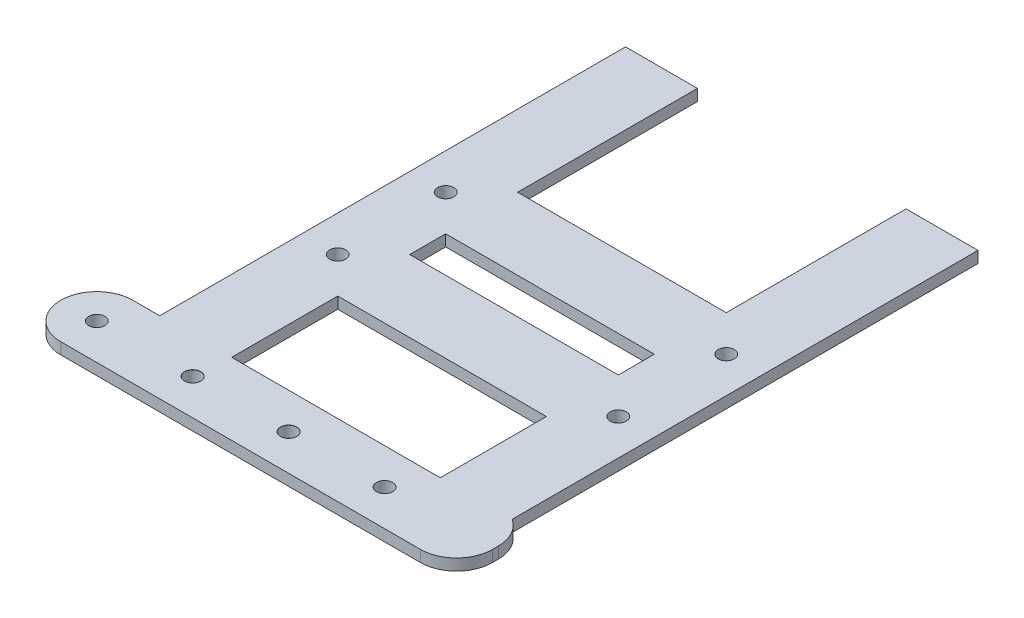
ISO-10303-21;
HEADER;
FILE_DESCRIPTION(('STEP AP214'),'2;1');
FILE_NAME('part.step','',(''),(''),'','','');
FILE_SCHEMA(('AUTOMOTIVE_DESIGN { 1 0 10303 214 1 1 1 1 }'));
ENDSEC;
DATA;
#1=APPLICATION_CONTEXT('core data for automotive mechanical design processes');
#2=APPLICATION_PROTOCOL_DEFINITION('international standard','automotive_design',2000,#1);
#3=PRODUCT_CONTEXT('',#1,'mechanical');
#4=PRODUCT('Part','Part','',(#3));
#5=PRODUCT_RELATED_PRODUCT_CATEGORY('part','',(#4));
#6=PRODUCT_DEFINITION_FORMATION('','',#4);
#7=PRODUCT_DEFINITION_CONTEXT('part definition',#1,'design');
#8=PRODUCT_DEFINITION('design','',#6,#7);
#9=PRODUCT_DEFINITION_SHAPE('','',#8);
#10=(LENGTH_UNIT() NAMED_UNIT(*) SI_UNIT(.MILLI.,.METRE.));
#11=(NAMED_UNIT(*) PLANE_ANGLE_UNIT() SI_UNIT($,.RADIAN.));
#12=(NAMED_UNIT(*) SI_UNIT($,.STERADIAN.) SOLID_ANGLE_UNIT());
#13=UNCERTAINTY_MEASURE_WITH_UNIT(LENGTH_MEASURE(1.E-05),#10,'distance_accuracy_value','');
#14=(GEOMETRIC_REPRESENTATION_CONTEXT(3) GLOBAL_UNCERTAINTY_ASSIGNED_CONTEXT((#13)) GLOBAL_UNIT_ASSIGNED_CONTEXT((#10,
#11,#12)) REPRESENTATION_CONTEXT('',''));
#15=CARTESIAN_POINT('',(0.,0.,0.));
#16=DIRECTION('',(0.,0.,1.));
#17=DIRECTION('',(1.,0.,0.));
#18=AXIS2_PLACEMENT_3D('',#15,#16,#17);
#19=CARTESIAN_POINT('',(0.,3.175,0.));
#20=DIRECTION('',(0.,-1.,0.));
#21=DIRECTION('',(0.,0.,-1.));
#22=AXIS2_PLACEMENT_3D('',#19,#20,#21);
#23=PLANE('',#22);
#24=CARTESIAN_POINT('',(13.3333333333333,3.175,190.));
#25=DIRECTION('',(0.,-1.,0.));
#26=DIRECTION('',(0.,0.,-1.));
#27=AXIS2_PLACEMENT_3D('',#24,#25,#26);
#28=CIRCLE('',#27,2.275);
#29=CARTESIAN_POINT('',(13.3333333333333,3.175,187.725));
#30=VERTEX_POINT('',#29);
#31=EDGE_CURVE('E819',#30,#30,#28,.T.);
#32=ORIENTED_EDGE('',*,*,#31,.T.);
#33=EDGE_LOOP('',(#32));
#34=FACE_BOUND('',#33,.T.);
#35=CARTESIAN_POINT('',(-13.3333333333333,3.175,190.));
#36=DIRECTION('',(0.,-1.,0.));
#37=DIRECTION('',(0.,0.,-1.));
#38=AXIS2_PLACEMENT_3D('',#35,#36,#37);
#39=CIRCLE('',#38,2.275);
#40=CARTESIAN_POINT('',(-13.3333333333333,3.175,187.725));
#41=VERTEX_POINT('',#40);
#42=EDGE_CURVE('E827',#41,#41,#39,.T.);
#43=ORIENTED_EDGE('',*,*,#42,.T.);
#44=EDGE_LOOP('',(#43));
#45=FACE_BOUND('',#44,.T.);
#46=DIRECTION('',(-1.,0.,0.));
#47=VECTOR('',#46,1.);
#48=CARTESIAN_POINT('',(-12.5,3.175,150.5));
#49=LINE('',#48,#47);
#50=CARTESIAN_POINT('',(45.5,3.175,150.5));
#51=VERTEX_POINT('',#50);
#52=CARTESIAN_POINT('',(-12.5,3.175,150.5));
#53=VERTEX_POINT('',#52);
#54=EDGE_CURVE('E382',#51,#53,#49,.T.);
#55=ORIENTED_EDGE('',*,*,#54,.F.);
#56=DIRECTION('',(0.,0.,-1.));
#57=VECTOR('',#56,1.);
#58=CARTESIAN_POINT('',(45.5,3.175,150.5));
#59=LINE('',#58,#57);
#60=CARTESIAN_POINT('',(45.5,3.175,180.));
#61=VERTEX_POINT('',#60);
#62=EDGE_CURVE('E379',#61,#51,#59,.T.);
#63=ORIENTED_EDGE('',*,*,#62,.F.);
#64=DIRECTION('',(1.,0.,0.));
#65=VECTOR('',#64,1.);
#66=CARTESIAN_POINT('',(-12.5,3.175,180.));
#67=LINE('',#66,#65);
#68=CARTESIAN_POINT('',(-12.5,3.175,180.));
#69=VERTEX_POINT('',#68);
#70=EDGE_CURVE('E375',#69,#61,#67,.T.);
#71=ORIENTED_EDGE('',*,*,#70,.F.);
#72=DIRECTION('',(0.,0.,1.));
#73=VECTOR('',#72,1.);
#74=CARTESIAN_POINT('',(-12.5,3.175,150.5));
#75=LINE('',#74,#73);
#76=EDGE_CURVE('E374',#53,#69,#75,.T.);
#77=ORIENTED_EDGE('',*,*,#76,.F.);
#78=EDGE_LOOP('',(#55,#63,#71,#77));
#79=FACE_BOUND('',#78,.T.);
#80=DIRECTION('',(0.,0.,1.));
#81=VECTOR('',#80,1.);
#82=CARTESIAN_POINT('',(65.5,3.175,-85.));
#83=LINE('',#82,#81);
#84=CARTESIAN_POINT('',(65.5,3.175,50.5));
#85=VERTEX_POINT('',#84);
#86=CARTESIAN_POINT('',(65.5,3.175,180.));
#87=VERTEX_POINT('',#86);
#88=EDGE_CURVE('E225',#85,#87,#83,.T.);
#89=ORIENTED_EDGE('',*,*,#88,.F.);
#90=DIRECTION('',(1.,0.,0.));
#91=VECTOR('',#90,1.);
#92=CARTESIAN_POINT('',(-50.,3.175,50.5));
#93=LINE('',#92,#91);
#94=CARTESIAN_POINT('',(45.5,3.175,50.5));
#95=VERTEX_POINT('',#94);
#96=EDGE_CURVE('E215',#95,#85,#93,.T.);
#97=ORIENTED_EDGE('',*,*,#96,.F.);
#98=DIRECTION('',(0.,0.,-1.));
#99=VECTOR('',#98,1.);
#100=CARTESIAN_POINT('',(45.5,3.175,34.5));
#101=LINE('',#100,#99);
#102=CARTESIAN_POINT('',(45.5,3.175,100.5));
#103=VERTEX_POINT('',#102);
#104=EDGE_CURVE('E398',#103,#95,#101,.T.);
#105=ORIENTED_EDGE('',*,*,#104,.F.);
#106=DIRECTION('',(1.,0.,0.));
#107=VECTOR('',#106,1.);
#108=CARTESIAN_POINT('',(-12.5,3.175,100.5));
#109=LINE('',#108,#107);
#110=CARTESIAN_POINT('',(-12.5,3.175,100.5));
#111=VERTEX_POINT('',#110);
#112=EDGE_CURVE('E400',#111,#103,#109,.T.);
#113=ORIENTED_EDGE('',*,*,#112,.F.);
#114=DIRECTION('',(0.,0.,1.));
#115=VECTOR('',#114,1.);
#116=CARTESIAN_POINT('',(-12.5,3.175,34.5));
#117=LINE('',#116,#115);
#118=CARTESIAN_POINT('',(-12.5,3.175,50.5));
#119=VERTEX_POINT('',#118);
#120=EDGE_CURVE('E214',#119,#111,#117,.T.);
#121=ORIENTED_EDGE('',*,*,#120,.F.);
#122=CARTESIAN_POINT('',(-32.5,3.175,50.5));
#123=VERTEX_POINT('',#122);
#124=EDGE_CURVE('E72',#123,#119,#93,.T.);
#125=ORIENTED_EDGE('',*,*,#124,.F.);
#126=DIRECTION('',(0.,0.,-1.));
#127=VECTOR('',#126,1.);
#128=CARTESIAN_POINT('',(-32.5,3.175,180.));
#129=LINE('',#128,#127);
#130=CARTESIAN_POINT('',(-32.5,3.175,180.));
#131=VERTEX_POINT('',#130);
#132=EDGE_CURVE('E212',#131,#123,#129,.T.);
#133=ORIENTED_EDGE('',*,*,#132,.F.);
#134=DIRECTION('',(1.,0.,0.));
#135=VECTOR('',#134,1.);
#136=CARTESIAN_POINT('',(-32.5,3.175,180.));
#137=LINE('',#136,#135);
#138=CARTESIAN_POINT('',(-40.,3.175,180.));
#139=VERTEX_POINT('',#138);
#140=EDGE_CURVE('E222',#139,#131,#137,.T.);
#141=ORIENTED_EDGE('',*,*,#140,.F.);
#142=CARTESIAN_POINT('',(-40.,3.17499999999998,190.));
#143=DIRECTION('',(0.,-1.,0.));
#144=DIRECTION('',(0.,0.,-1.));
#145=AXIS2_PLACEMENT_3D('',#142,#143,#144);
#146=CIRCLE('',#145,10.);
#147=CARTESIAN_POINT('',(-50.,3.175,190.));
#148=VERTEX_POINT('',#147);
#149=EDGE_CURVE('E283',#139,#148,#146,.F.);
#150=ORIENTED_EDGE('',*,*,#149,.T.);
#151=CARTESIAN_POINT('',(-40.,3.175,190.));
#152=DIRECTION('',(0.,-1.,0.));
#153=DIRECTION('',(0.,0.,-1.));
#154=AXIS2_PLACEMENT_3D('',#151,#152,#153);
#155=CIRCLE('',#154,10.);
#156=CARTESIAN_POINT('',(-40.,3.175,200.));
#157=VERTEX_POINT('',#156);
#158=EDGE_CURVE('E279',#148,#157,#155,.F.);
#159=ORIENTED_EDGE('',*,*,#158,.T.);
#160=DIRECTION('',(1.,0.,0.));
#161=VECTOR('',#160,1.);
#162=CARTESIAN_POINT('',(-50.,3.175,200.));
#163=LINE('',#162,#161);
#164=CARTESIAN_POINT('',(60.,3.175,200.));
#165=VERTEX_POINT('',#164);
#166=EDGE_CURVE('E276',#157,#165,#163,.T.);
#167=ORIENTED_EDGE('',*,*,#166,.T.);
#168=CARTESIAN_POINT('',(60.,3.175,190.));
#169=DIRECTION('',(0.,-1.,0.));
#170=DIRECTION('',(0.,0.,-1.));
#171=AXIS2_PLACEMENT_3D('',#168,#169,#170);
#172=CIRCLE('',#171,10.);
#173=CARTESIAN_POINT('',(70.,3.175,190.));
#174=VERTEX_POINT('',#173);
#175=EDGE_CURVE('E285',#165,#174,#172,.F.);
#176=ORIENTED_EDGE('',*,*,#175,.T.);
#177=DIRECTION('',(0.,0.,1.));
#178=VECTOR('',#177,1.);
#179=CARTESIAN_POINT('',(70.,3.175,200.));
#180=LINE('',#179,#178);
#181=CARTESIAN_POINT('',(70.,3.17499999999998,188.351646544245));
#182=VERTEX_POINT('',#181);
#183=EDGE_CURVE('E260',#182,#174,#180,.T.);
#184=ORIENTED_EDGE('',*,*,#183,.F.);
#185=CARTESIAN_POINT('',(60.,3.17499999999998,188.351646544245));
#186=DIRECTION('',(0.,-1.,0.));
#187=DIRECTION('',(0.,0.,-1.));
#188=AXIS2_PLACEMENT_3D('',#185,#186,#187);
#189=CIRCLE('',#188,10.);
#190=EDGE_CURVE('E287',#182,#87,#189,.F.);
#191=ORIENTED_EDGE('',*,*,#190,.T.);
#192=EDGE_LOOP('',(#89,#97,#105,#113,#121,#125,#133,#141,#150,#159,#167,#176,#184,#191));
#193=FACE_BOUND('',#192,.T.);
#194=DIRECTION('',(0.,0.,-1.));
#195=VECTOR('',#194,1.);
#196=CARTESIAN_POINT('',(45.5,3.175,120.5));
#197=LINE('',#196,#195);
#198=CARTESIAN_POINT('',(45.5,3.175,130.5));
#199=VERTEX_POINT('',#198);
#200=CARTESIAN_POINT('',(45.5,3.175,120.5));
#201=VERTEX_POINT('',#200);
#202=EDGE_CURVE('E349',#199,#201,#197,.T.);
#203=ORIENTED_EDGE('',*,*,#202,.F.);
#204=DIRECTION('',(1.,0.,0.));
#205=VECTOR('',#204,1.);
#206=CARTESIAN_POINT('',(-12.5,3.175,130.5));
#207=LINE('',#206,#205);
#208=CARTESIAN_POINT('',(-12.5,3.175,130.5));
#209=VERTEX_POINT('',#208);
#210=EDGE_CURVE('E346',#209,#199,#207,.T.);
#211=ORIENTED_EDGE('',*,*,#210,.F.);
#212=DIRECTION('',(0.,0.,1.));
#213=VECTOR('',#212,1.);
#214=CARTESIAN_POINT('',(-12.5,3.175,130.5));
#215=LINE('',#214,#213);
#216=CARTESIAN_POINT('',(-12.5,3.175,120.5));
#217=VERTEX_POINT('',#216);
#218=EDGE_CURVE('E342',#217,#209,#215,.T.);
#219=ORIENTED_EDGE('',*,*,#218,.F.);
#220=DIRECTION('',(-1.,0.,0.));
#221=VECTOR('',#220,1.);
#222=CARTESIAN_POINT('',(-12.5,3.175,120.5));
#223=LINE('',#222,#221);
#224=EDGE_CURVE('E341',#201,#217,#223,.T.);
#225=ORIENTED_EDGE('',*,*,#224,.F.);
#226=EDGE_LOOP('',(#203,#211,#219,#225));
#227=FACE_BOUND('',#226,.T.);
#228=CARTESIAN_POINT('',(40.,3.175,190.));
#229=DIRECTION('',(0.,1.,0.));
#230=DIRECTION('',(0.,0.,1.));
#231=AXIS2_PLACEMENT_3D('',#228,#229,#230);
#232=CIRCLE('',#231,2.25);
#233=CARTESIAN_POINT('',(40.,3.175,192.25));
#234=VERTEX_POINT('',#233);
#235=EDGE_CURVE('E263',#234,#234,#232,.T.);
#236=ORIENTED_EDGE('',*,*,#235,.F.);
#237=EDGE_LOOP('',(#236));
#238=FACE_BOUND('',#237,.T.);
#239=CARTESIAN_POINT('',(-40.,3.175,190.));
#240=DIRECTION('',(0.,1.,0.));
#241=DIRECTION('',(0.,0.,1.));
#242=AXIS2_PLACEMENT_3D('',#239,#240,#241);
#243=CIRCLE('',#242,2.25);
#244=CARTESIAN_POINT('',(-40.,3.175,192.25));
#245=VERTEX_POINT('',#244);
#246=EDGE_CURVE('E269',#245,#245,#243,.T.);
#247=ORIENTED_EDGE('',*,*,#246,.F.);
#248=EDGE_LOOP('',(#247));
#249=FACE_BOUND('',#248,.T.);
#250=CARTESIAN_POINT('',(-22.5,3.175,140.5));
#251=DIRECTION('',(0.,1.,0.));
#252=DIRECTION('',(0.,0.,1.));
#253=AXIS2_PLACEMENT_3D('',#250,#251,#252);
#254=CIRCLE('',#253,2.25);
#255=CARTESIAN_POINT('',(-22.5,3.175,142.75));
#256=VERTEX_POINT('',#255);
#257=EDGE_CURVE('E251',#256,#256,#254,.T.);
#258=ORIENTED_EDGE('',*,*,#257,.F.);
#259=EDGE_LOOP('',(#258));
#260=FACE_BOUND('',#259,.T.);
#261=CARTESIAN_POINT('',(-22.5,3.175,110.5));
#262=DIRECTION('',(0.,1.,0.));
#263=DIRECTION('',(0.,0.,1.));
#264=AXIS2_PLACEMENT_3D('',#261,#262,#263);
#265=CIRCLE('',#264,2.25);
#266=CARTESIAN_POINT('',(-22.5,3.175,112.75));
#267=VERTEX_POINT('',#266);
#268=EDGE_CURVE('E245',#267,#267,#265,.T.);
#269=ORIENTED_EDGE('',*,*,#268,.F.);
#270=EDGE_LOOP('',(#269));
#271=FACE_BOUND('',#270,.T.);
#272=CARTESIAN_POINT('',(55.5,3.175,110.5));
#273=DIRECTION('',(0.,1.,0.));
#274=DIRECTION('',(0.,0.,1.));
#275=AXIS2_PLACEMENT_3D('',#272,#273,#274);
#276=CIRCLE('',#275,2.25);
#277=CARTESIAN_POINT('',(55.5,3.175,112.75));
#278=VERTEX_POINT('',#277);
#279=EDGE_CURVE('E239',#278,#278,#276,.T.);
#280=ORIENTED_EDGE('',*,*,#279,.F.);
#281=EDGE_LOOP('',(#280));
#282=FACE_BOUND('',#281,.T.);
#283=CARTESIAN_POINT('',(55.5,3.175,140.5));
#284=DIRECTION('',(0.,1.,0.));
#285=DIRECTION('',(0.,0.,1.));
#286=AXIS2_PLACEMENT_3D('',#283,#284,#285);
#287=CIRCLE('',#286,2.25);
#288=CARTESIAN_POINT('',(55.5,3.175,142.75));
#289=VERTEX_POINT('',#288);
#290=EDGE_CURVE('E232',#289,#289,#287,.T.);
#291=ORIENTED_EDGE('',*,*,#290,.F.);
#292=EDGE_LOOP('',(#291));
#293=FACE_BOUND('',#292,.T.);
#294=ADVANCED_FACE('F49',(#34,#45,#79,#193,#227,#238,#249,#260,#271,#282,#293),#23,.F.);
#295=CARTESIAN_POINT('',(-50.,3.175,200.));
#296=DIRECTION('',(0.,0.,-1.));
#297=DIRECTION('',(-1.,0.,0.));
#298=AXIS2_PLACEMENT_3D('',#295,#296,#297);
#299=PLANE('',#298);
#300=DIRECTION('',(1.,0.,0.));
#301=VECTOR('',#300,1.);
#302=CARTESIAN_POINT('',(-50.,0.,200.));
#303=LINE('',#302,#301);
#304=CARTESIAN_POINT('',(-40.,0.,200.));
#305=VERTEX_POINT('',#304);
#306=CARTESIAN_POINT('',(60.,0.,200.));
#307=VERTEX_POINT('',#306);
#308=EDGE_CURVE('E275',#305,#307,#303,.T.);
#309=ORIENTED_EDGE('',*,*,#308,.T.);
#310=DIRECTION('',(0.,-1.,0.));
#311=VECTOR('',#310,1.);
#312=CARTESIAN_POINT('',(60.,3.175,200.));
#313=LINE('',#312,#311);
#314=EDGE_CURVE('E57',#307,#165,#313,.F.);
#315=ORIENTED_EDGE('',*,*,#314,.T.);
#316=ORIENTED_EDGE('',*,*,#166,.F.);
#317=DIRECTION('',(0.,-1.,0.));
#318=VECTOR('',#317,1.);
#319=CARTESIAN_POINT('',(-40.,3.175,200.));
#320=LINE('',#319,#318);
#321=EDGE_CURVE('E307',#157,#305,#320,.T.);
#322=ORIENTED_EDGE('',*,*,#321,.T.);
#323=EDGE_LOOP('',(#309,#315,#316,#322));
#324=FACE_BOUND('',#323,.T.);
#325=ADVANCED_FACE('F428',(#324),#299,.F.);
#326=CARTESIAN_POINT('',(0.,0.,0.));
#327=DIRECTION('',(0.,-1.,0.));
#328=DIRECTION('',(0.,0.,-1.));
#329=AXIS2_PLACEMENT_3D('',#326,#327,#328);
#330=PLANE('',#329);
#331=CARTESIAN_POINT('',(13.3333333333333,0.,190.));
#332=DIRECTION('',(0.,-1.,0.));
#333=DIRECTION('',(0.,0.,-1.));
#334=AXIS2_PLACEMENT_3D('',#331,#332,#333);
#335=CIRCLE('',#334,2.275);
#336=CARTESIAN_POINT('',(13.3333333333333,0.,187.725));
#337=VERTEX_POINT('',#336);
#338=EDGE_CURVE('E818',#337,#337,#335,.T.);
#339=ORIENTED_EDGE('',*,*,#338,.F.);
#340=EDGE_LOOP('',(#339));
#341=FACE_BOUND('',#340,.T.);
#342=CARTESIAN_POINT('',(-13.3333333333333,0.,190.));
#343=DIRECTION('',(0.,-1.,0.));
#344=DIRECTION('',(0.,0.,-1.));
#345=AXIS2_PLACEMENT_3D('',#342,#343,#344);
#346=CIRCLE('',#345,2.275);
#347=CARTESIAN_POINT('',(-13.3333333333333,0.,187.725));
#348=VERTEX_POINT('',#347);
#349=EDGE_CURVE('E830',#348,#348,#346,.T.);
#350=ORIENTED_EDGE('',*,*,#349,.F.);
#351=EDGE_LOOP('',(#350));
#352=FACE_BOUND('',#351,.T.);
#353=DIRECTION('',(1.,0.,0.));
#354=VECTOR('',#353,1.);
#355=CARTESIAN_POINT('',(-50.,0.,50.5));
#356=LINE('',#355,#354);
#357=CARTESIAN_POINT('',(45.5,0.,50.5));
#358=VERTEX_POINT('',#357);
#359=CARTESIAN_POINT('',(65.5,0.,50.5));
#360=VERTEX_POINT('',#359);
#361=EDGE_CURVE('E64',#358,#360,#356,.T.);
#362=ORIENTED_EDGE('',*,*,#361,.T.);
#363=DIRECTION('',(0.,0.,1.));
#364=VECTOR('',#363,1.);
#365=CARTESIAN_POINT('',(65.5,0.,-85.));
#366=LINE('',#365,#364);
#367=CARTESIAN_POINT('',(65.5,0.,180.));
#368=VERTEX_POINT('',#367);
#369=EDGE_CURVE('E406',#360,#368,#366,.T.);
#370=ORIENTED_EDGE('',*,*,#369,.T.);
#371=CARTESIAN_POINT('',(60.,0.,188.351646544245));
#372=DIRECTION('',(0.,-1.,0.));
#373=DIRECTION('',(0.,0.,-1.));
#374=AXIS2_PLACEMENT_3D('',#371,#372,#373);
#375=CIRCLE('',#374,10.);
#376=CARTESIAN_POINT('',(70.,0.,188.351646544245));
#377=VERTEX_POINT('',#376);
#378=EDGE_CURVE('E296',#368,#377,#375,.T.);
#379=ORIENTED_EDGE('',*,*,#378,.T.);
#380=DIRECTION('',(0.,0.,-1.));
#381=VECTOR('',#380,1.);
#382=CARTESIAN_POINT('',(70.,0.,200.));
#383=LINE('',#382,#381);
#384=CARTESIAN_POINT('',(70.,0.,190.));
#385=VERTEX_POINT('',#384);
#386=EDGE_CURVE('E257',#385,#377,#383,.T.);
#387=ORIENTED_EDGE('',*,*,#386,.F.);
#388=CARTESIAN_POINT('',(60.,0.,190.));
#389=DIRECTION('',(0.,-1.,0.));
#390=DIRECTION('',(0.,0.,-1.));
#391=AXIS2_PLACEMENT_3D('',#388,#389,#390);
#392=CIRCLE('',#391,10.);
#393=EDGE_CURVE('E294',#385,#307,#392,.T.);
#394=ORIENTED_EDGE('',*,*,#393,.T.);
#395=ORIENTED_EDGE('',*,*,#308,.F.);
#396=CARTESIAN_POINT('',(-40.,0.,190.));
#397=DIRECTION('',(0.,-1.,0.));
#398=DIRECTION('',(0.,0.,-1.));
#399=AXIS2_PLACEMENT_3D('',#396,#397,#398);
#400=CIRCLE('',#399,10.);
#401=CARTESIAN_POINT('',(-50.,0.,190.));
#402=VERTEX_POINT('',#401);
#403=EDGE_CURVE('E290',#305,#402,#400,.T.);
#404=ORIENTED_EDGE('',*,*,#403,.T.);
#405=CARTESIAN_POINT('',(-40.,0.,190.));
#406=DIRECTION('',(0.,-1.,0.));
#407=DIRECTION('',(0.,0.,-1.));
#408=AXIS2_PLACEMENT_3D('',#405,#406,#407);
#409=CIRCLE('',#408,10.);
#410=CARTESIAN_POINT('',(-40.,0.,180.));
#411=VERTEX_POINT('',#410);
#412=EDGE_CURVE('E292',#402,#411,#409,.T.);
#413=ORIENTED_EDGE('',*,*,#412,.T.);
#414=DIRECTION('',(1.,0.,0.));
#415=VECTOR('',#414,1.);
#416=CARTESIAN_POINT('',(-32.5,0.,180.));
#417=LINE('',#416,#415);
#418=CARTESIAN_POINT('',(-32.5,0.,180.));
#419=VERTEX_POINT('',#418);
#420=EDGE_CURVE('E221',#411,#419,#417,.T.);
#421=ORIENTED_EDGE('',*,*,#420,.T.);
#422=DIRECTION('',(0.,0.,-1.));
#423=VECTOR('',#422,1.);
#424=CARTESIAN_POINT('',(-32.5,0.,180.));
#425=LINE('',#424,#423);
#426=CARTESIAN_POINT('',(-32.5,0.,50.5));
#427=VERTEX_POINT('',#426);
#428=EDGE_CURVE('E230',#419,#427,#425,.T.);
#429=ORIENTED_EDGE('',*,*,#428,.T.);
#430=CARTESIAN_POINT('',(-12.5,0.,50.5));
#431=VERTEX_POINT('',#430);
#432=EDGE_CURVE('E198',#427,#431,#356,.T.);
#433=ORIENTED_EDGE('',*,*,#432,.T.);
#434=DIRECTION('',(0.,0.,1.));
#435=VECTOR('',#434,1.);
#436=CARTESIAN_POINT('',(-12.5,0.,34.5));
#437=LINE('',#436,#435);
#438=CARTESIAN_POINT('',(-12.5,0.,100.5));
#439=VERTEX_POINT('',#438);
#440=EDGE_CURVE('E388',#431,#439,#437,.T.);
#441=ORIENTED_EDGE('',*,*,#440,.T.);
#442=DIRECTION('',(1.,0.,0.));
#443=VECTOR('',#442,1.);
#444=CARTESIAN_POINT('',(-12.5,0.,100.5));
#445=LINE('',#444,#443);
#446=CARTESIAN_POINT('',(45.5,0.,100.5));
#447=VERTEX_POINT('',#446);
#448=EDGE_CURVE('E391',#439,#447,#445,.T.);
#449=ORIENTED_EDGE('',*,*,#448,.T.);
#450=DIRECTION('',(0.,0.,-1.));
#451=VECTOR('',#450,1.);
#452=CARTESIAN_POINT('',(45.5,0.,34.5));
#453=LINE('',#452,#451);
#454=EDGE_CURVE('E392',#447,#358,#453,.T.);
#455=ORIENTED_EDGE('',*,*,#454,.T.);
#456=EDGE_LOOP('',(#362,#370,#379,#387,#394,#395,#404,#413,#421,#429,#433,#441,#449,#455));
#457=FACE_BOUND('',#456,.T.);
#458=DIRECTION('',(0.,0.,-1.));
#459=VECTOR('',#458,1.);
#460=CARTESIAN_POINT('',(45.5,0.,150.5));
#461=LINE('',#460,#459);
#462=CARTESIAN_POINT('',(45.5,0.,180.));
#463=VERTEX_POINT('',#462);
#464=CARTESIAN_POINT('',(45.5,0.,150.5));
#465=VERTEX_POINT('',#464);
#466=EDGE_CURVE('E358',#463,#465,#461,.T.);
#467=ORIENTED_EDGE('',*,*,#466,.T.);
#468=DIRECTION('',(-1.,0.,0.));
#469=VECTOR('',#468,1.);
#470=CARTESIAN_POINT('',(-12.5,0.,150.5));
#471=LINE('',#470,#469);
#472=CARTESIAN_POINT('',(-12.5,0.,150.5));
#473=VERTEX_POINT('',#472);
#474=EDGE_CURVE('E359',#465,#473,#471,.T.);
#475=ORIENTED_EDGE('',*,*,#474,.T.);
#476=DIRECTION('',(0.,0.,1.));
#477=VECTOR('',#476,1.);
#478=CARTESIAN_POINT('',(-12.5,0.,150.5));
#479=LINE('',#478,#477);
#480=CARTESIAN_POINT('',(-12.5,0.,180.));
#481=VERTEX_POINT('',#480);
#482=EDGE_CURVE('E362',#473,#481,#479,.T.);
#483=ORIENTED_EDGE('',*,*,#482,.T.);
#484=DIRECTION('',(1.,0.,0.));
#485=VECTOR('',#484,1.);
#486=CARTESIAN_POINT('',(-12.5,0.,180.));
#487=LINE('',#486,#485);
#488=EDGE_CURVE('E355',#481,#463,#487,.T.);
#489=ORIENTED_EDGE('',*,*,#488,.T.);
#490=EDGE_LOOP('',(#467,#475,#483,#489));
#491=FACE_BOUND('',#490,.T.);
#492=DIRECTION('',(1.,0.,0.));
#493=VECTOR('',#492,1.);
#494=CARTESIAN_POINT('',(-12.5,0.,130.5));
#495=LINE('',#494,#493);
#496=CARTESIAN_POINT('',(-12.5,0.,130.5));
#497=VERTEX_POINT('',#496);
#498=CARTESIAN_POINT('',(45.5,0.,130.5));
#499=VERTEX_POINT('',#498);
#500=EDGE_CURVE('E325',#497,#499,#495,.T.);
#501=ORIENTED_EDGE('',*,*,#500,.T.);
#502=DIRECTION('',(0.,0.,-1.));
#503=VECTOR('',#502,1.);
#504=CARTESIAN_POINT('',(45.5,0.,120.5));
#505=LINE('',#504,#503);
#506=CARTESIAN_POINT('',(45.5,0.,120.5));
#507=VERTEX_POINT('',#506);
#508=EDGE_CURVE('E326',#499,#507,#505,.T.);
#509=ORIENTED_EDGE('',*,*,#508,.T.);
#510=DIRECTION('',(-1.,0.,0.));
#511=VECTOR('',#510,1.);
#512=CARTESIAN_POINT('',(-12.5,0.,120.5));
#513=LINE('',#512,#511);
#514=CARTESIAN_POINT('',(-12.5,0.,120.5));
#515=VERTEX_POINT('',#514);
#516=EDGE_CURVE('E329',#507,#515,#513,.T.);
#517=ORIENTED_EDGE('',*,*,#516,.T.);
#518=DIRECTION('',(0.,0.,1.));
#519=VECTOR('',#518,1.);
#520=CARTESIAN_POINT('',(-12.5,0.,130.5));
#521=LINE('',#520,#519);
#522=EDGE_CURVE('E315',#515,#497,#521,.T.);
#523=ORIENTED_EDGE('',*,*,#522,.T.);
#524=EDGE_LOOP('',(#501,#509,#517,#523));
#525=FACE_BOUND('',#524,.T.);
#526=CARTESIAN_POINT('',(55.5,0.,140.5));
#527=DIRECTION('',(0.,-1.,0.));
#528=DIRECTION('',(0.,0.,-1.));
#529=AXIS2_PLACEMENT_3D('',#526,#527,#528);
#530=CIRCLE('',#529,2.25);
#531=CARTESIAN_POINT('',(55.5,0.,138.25));
#532=VERTEX_POINT('',#531);
#533=EDGE_CURVE('E236',#532,#532,#530,.T.);
#534=ORIENTED_EDGE('',*,*,#533,.F.);
#535=EDGE_LOOP('',(#534));
#536=FACE_BOUND('',#535,.T.);
#537=CARTESIAN_POINT('',(55.5,0.,110.5));
#538=DIRECTION('',(0.,-1.,0.));
#539=DIRECTION('',(0.,0.,-1.));
#540=AXIS2_PLACEMENT_3D('',#537,#538,#539);
#541=CIRCLE('',#540,2.25);
#542=CARTESIAN_POINT('',(55.5,0.,108.25));
#543=VERTEX_POINT('',#542);
#544=EDGE_CURVE('E242',#543,#543,#541,.T.);
#545=ORIENTED_EDGE('',*,*,#544,.F.);
#546=EDGE_LOOP('',(#545));
#547=FACE_BOUND('',#546,.T.);
#548=CARTESIAN_POINT('',(-22.5,0.,110.5));
#549=DIRECTION('',(0.,-1.,0.));
#550=DIRECTION('',(0.,0.,-1.));
#551=AXIS2_PLACEMENT_3D('',#548,#549,#550);
#552=CIRCLE('',#551,2.25);
#553=CARTESIAN_POINT('',(-22.5,0.,108.25));
#554=VERTEX_POINT('',#553);
#555=EDGE_CURVE('E248',#554,#554,#552,.T.);
#556=ORIENTED_EDGE('',*,*,#555,.F.);
#557=EDGE_LOOP('',(#556));
#558=FACE_BOUND('',#557,.T.);
#559=CARTESIAN_POINT('',(-22.5,0.,140.5));
#560=DIRECTION('',(0.,-1.,0.));
#561=DIRECTION('',(0.,0.,-1.));
#562=AXIS2_PLACEMENT_3D('',#559,#560,#561);
#563=CIRCLE('',#562,2.25);
#564=CARTESIAN_POINT('',(-22.5,0.,138.25));
#565=VERTEX_POINT('',#564);
#566=EDGE_CURVE('E254',#565,#565,#563,.T.);
#567=ORIENTED_EDGE('',*,*,#566,.F.);
#568=EDGE_LOOP('',(#567));
#569=FACE_BOUND('',#568,.T.);
#570=CARTESIAN_POINT('',(40.,0.,190.));
#571=DIRECTION('',(0.,-1.,0.));
#572=DIRECTION('',(0.,0.,-1.));
#573=AXIS2_PLACEMENT_3D('',#570,#571,#572);
#574=CIRCLE('',#573,2.25);
#575=CARTESIAN_POINT('',(40.,0.,187.75));
#576=VERTEX_POINT('',#575);
#577=EDGE_CURVE('E266',#576,#576,#574,.T.);
#578=ORIENTED_EDGE('',*,*,#577,.F.);
#579=EDGE_LOOP('',(#578));
#580=FACE_BOUND('',#579,.T.);
#581=CARTESIAN_POINT('',(-40.,0.,190.));
#582=DIRECTION('',(0.,-1.,0.));
#583=DIRECTION('',(0.,0.,-1.));
#584=AXIS2_PLACEMENT_3D('',#581,#582,#583);
#585=CIRCLE('',#584,2.25);
#586=CARTESIAN_POINT('',(-40.,0.,187.75));
#587=VERTEX_POINT('',#586);
#588=EDGE_CURVE('E272',#587,#587,#585,.T.);
#589=ORIENTED_EDGE('',*,*,#588,.F.);
#590=EDGE_LOOP('',(#589));
#591=FACE_BOUND('',#590,.T.);
#592=ADVANCED_FACE('F417',(#341,#352,#457,#491,#525,#536,#547,#558,#569,#580,#591),#330,.T.);
#593=CARTESIAN_POINT('',(-40.,3.175,190.));
#594=DIRECTION('',(0.,1.,0.));
#595=DIRECTION('',(0.,0.,1.));
#596=AXIS2_PLACEMENT_3D('',#593,#594,#595);
#597=CYLINDRICAL_SURFACE('',#596,2.25);
#598=ORIENTED_EDGE('',*,*,#246,.T.);
#599=EDGE_LOOP('',(#598));
#600=FACE_BOUND('',#599,.T.);
#601=ORIENTED_EDGE('',*,*,#588,.T.);
#602=EDGE_LOOP('',(#601));
#603=FACE_BOUND('',#602,.T.);
#604=ADVANCED_FACE('F459',(#600,#603),#597,.F.);
#605=CARTESIAN_POINT('',(40.,3.175,190.));
#606=DIRECTION('',(0.,1.,0.));
#607=DIRECTION('',(0.,0.,1.));
#608=AXIS2_PLACEMENT_3D('',#605,#606,#607);
#609=CYLINDRICAL_SURFACE('',#608,2.25);
#610=ORIENTED_EDGE('',*,*,#235,.T.);
#611=EDGE_LOOP('',(#610));
#612=FACE_BOUND('',#611,.T.);
#613=ORIENTED_EDGE('',*,*,#577,.T.);
#614=EDGE_LOOP('',(#613));
#615=FACE_BOUND('',#614,.T.);
#616=ADVANCED_FACE('F516',(#612,#615),#609,.F.);
#617=CARTESIAN_POINT('',(70.,0.,0.));
#618=DIRECTION('',(-1.,0.,0.));
#619=DIRECTION('',(0.,0.,1.));
#620=AXIS2_PLACEMENT_3D('',#617,#618,#619);
#621=PLANE('',#620);
#622=ORIENTED_EDGE('',*,*,#386,.T.);
#623=DIRECTION('',(0.,-1.,0.));
#624=VECTOR('',#623,1.);
#625=CARTESIAN_POINT('',(70.,0.,188.351646544245));
#626=LINE('',#625,#624);
#627=EDGE_CURVE('E301',#377,#182,#626,.F.);
#628=ORIENTED_EDGE('',*,*,#627,.T.);
#629=ORIENTED_EDGE('',*,*,#183,.T.);
#630=DIRECTION('',(0.,-1.,0.));
#631=VECTOR('',#630,1.);
#632=CARTESIAN_POINT('',(70.,0.,190.));
#633=LINE('',#632,#631);
#634=EDGE_CURVE('E298',#174,#385,#633,.T.);
#635=ORIENTED_EDGE('',*,*,#634,.T.);
#636=EDGE_LOOP('',(#622,#628,#629,#635));
#637=FACE_BOUND('',#636,.T.);
#638=ADVANCED_FACE('F420',(#637),#621,.F.);
#639=CARTESIAN_POINT('',(-22.5,3.175,140.5));
#640=DIRECTION('',(0.,1.,0.));
#641=DIRECTION('',(0.,0.,1.));
#642=AXIS2_PLACEMENT_3D('',#639,#640,#641);
#643=CYLINDRICAL_SURFACE('',#642,2.25);
#644=ORIENTED_EDGE('',*,*,#257,.T.);
#645=EDGE_LOOP('',(#644));
#646=FACE_BOUND('',#645,.T.);
#647=ORIENTED_EDGE('',*,*,#566,.T.);
#648=EDGE_LOOP('',(#647));
#649=FACE_BOUND('',#648,.T.);
#650=ADVANCED_FACE('F510',(#646,#649),#643,.F.);
#651=CARTESIAN_POINT('',(-22.5,3.175,110.5));
#652=DIRECTION('',(0.,1.,0.));
#653=DIRECTION('',(0.,0.,1.));
#654=AXIS2_PLACEMENT_3D('',#651,#652,#653);
#655=CYLINDRICAL_SURFACE('',#654,2.25);
#656=ORIENTED_EDGE('',*,*,#268,.T.);
#657=EDGE_LOOP('',(#656));
#658=FACE_BOUND('',#657,.T.);
#659=ORIENTED_EDGE('',*,*,#555,.T.);
#660=EDGE_LOOP('',(#659));
#661=FACE_BOUND('',#660,.T.);
#662=ADVANCED_FACE('F506',(#658,#661),#655,.F.);
#663=CARTESIAN_POINT('',(55.5,3.175,110.5));
#664=DIRECTION('',(0.,1.,0.));
#665=DIRECTION('',(0.,0.,1.));
#666=AXIS2_PLACEMENT_3D('',#663,#664,#665);
#667=CYLINDRICAL_SURFACE('',#666,2.25);
#668=ORIENTED_EDGE('',*,*,#279,.T.);
#669=EDGE_LOOP('',(#668));
#670=FACE_BOUND('',#669,.T.);
#671=ORIENTED_EDGE('',*,*,#544,.T.);
#672=EDGE_LOOP('',(#671));
#673=FACE_BOUND('',#672,.T.);
#674=ADVANCED_FACE('F502',(#670,#673),#667,.F.);
#675=CARTESIAN_POINT('',(55.5,3.175,140.5));
#676=DIRECTION('',(0.,1.,0.));
#677=DIRECTION('',(0.,0.,1.));
#678=AXIS2_PLACEMENT_3D('',#675,#676,#677);
#679=CYLINDRICAL_SURFACE('',#678,2.25);
#680=ORIENTED_EDGE('',*,*,#290,.T.);
#681=EDGE_LOOP('',(#680));
#682=FACE_BOUND('',#681,.T.);
#683=ORIENTED_EDGE('',*,*,#533,.T.);
#684=EDGE_LOOP('',(#683));
#685=FACE_BOUND('',#684,.T.);
#686=ADVANCED_FACE('F495',(#682,#685),#679,.F.);
#687=CARTESIAN_POINT('',(65.5,-265.577201581762,-85.));
#688=DIRECTION('',(-1.,0.,0.));
#689=DIRECTION('',(0.,0.,1.));
#690=AXIS2_PLACEMENT_3D('',#687,#688,#689);
#691=PLANE('',#690);
#692=ORIENTED_EDGE('',*,*,#369,.F.);
#693=DIRECTION('',(0.,1.,0.));
#694=VECTOR('',#693,1.);
#695=CARTESIAN_POINT('',(65.5,-265.577201581762,50.5));
#696=LINE('',#695,#694);
#697=EDGE_CURVE('E203',#360,#85,#696,.T.);
#698=ORIENTED_EDGE('',*,*,#697,.T.);
#699=ORIENTED_EDGE('',*,*,#88,.T.);
#700=DIRECTION('',(0.,1.,0.));
#701=VECTOR('',#700,1.);
#702=CARTESIAN_POINT('',(65.5,-265.577201581762,180.));
#703=LINE('',#702,#701);
#704=EDGE_CURVE('E378',#368,#87,#703,.T.);
#705=ORIENTED_EDGE('',*,*,#704,.F.);
#706=EDGE_LOOP('',(#692,#698,#699,#705));
#707=FACE_BOUND('',#706,.T.);
#708=ADVANCED_FACE('F409',(#707),#691,.F.);
#709=CARTESIAN_POINT('',(-32.5,-265.577201581762,180.));
#710=DIRECTION('',(0.,0.,1.));
#711=DIRECTION('',(1.,0.,0.));
#712=AXIS2_PLACEMENT_3D('',#709,#710,#711);
#713=PLANE('',#712);
#714=ORIENTED_EDGE('',*,*,#420,.F.);
#715=DIRECTION('',(0.,1.,0.));
#716=VECTOR('',#715,1.);
#717=CARTESIAN_POINT('',(-40.,-265.577201581762,180.));
#718=LINE('',#717,#716);
#719=EDGE_CURVE('E304',#411,#139,#718,.T.);
#720=ORIENTED_EDGE('',*,*,#719,.T.);
#721=ORIENTED_EDGE('',*,*,#140,.T.);
#722=DIRECTION('',(0.,1.,0.));
#723=VECTOR('',#722,1.);
#724=CARTESIAN_POINT('',(-32.5,-265.577201581762,180.));
#725=LINE('',#724,#723);
#726=EDGE_CURVE('E220',#419,#131,#725,.T.);
#727=ORIENTED_EDGE('',*,*,#726,.F.);
#728=EDGE_LOOP('',(#714,#720,#721,#727));
#729=FACE_BOUND('',#728,.T.);
#730=ADVANCED_FACE('F437',(#729),#713,.F.);
#731=CARTESIAN_POINT('',(-32.5,-265.577201581762,180.));
#732=DIRECTION('',(1.,0.,0.));
#733=DIRECTION('',(0.,0.,-1.));
#734=AXIS2_PLACEMENT_3D('',#731,#732,#733);
#735=PLANE('',#734);
#736=ORIENTED_EDGE('',*,*,#132,.T.);
#737=DIRECTION('',(0.,-1.,0.));
#738=VECTOR('',#737,1.);
#739=CARTESIAN_POINT('',(-32.5,-265.577201581762,50.5));
#740=LINE('',#739,#738);
#741=EDGE_CURVE('E195',#123,#427,#740,.T.);
#742=ORIENTED_EDGE('',*,*,#741,.T.);
#743=ORIENTED_EDGE('',*,*,#428,.F.);
#744=ORIENTED_EDGE('',*,*,#726,.T.);
#745=EDGE_LOOP('',(#736,#742,#743,#744));
#746=FACE_BOUND('',#745,.T.);
#747=ADVANCED_FACE('F218',(#746),#735,.F.);
#748=CARTESIAN_POINT('',(-12.5,-265.577201581762,130.5));
#749=DIRECTION('',(0.,0.,1.));
#750=DIRECTION('',(1.,0.,0.));
#751=AXIS2_PLACEMENT_3D('',#748,#749,#750);
#752=PLANE('',#751);
#753=DIRECTION('',(0.,1.,0.));
#754=VECTOR('',#753,1.);
#755=CARTESIAN_POINT('',(-12.5,-265.577201581762,130.5));
#756=LINE('',#755,#754);
#757=EDGE_CURVE('E311',#497,#209,#756,.T.);
#758=ORIENTED_EDGE('',*,*,#757,.T.);
#759=ORIENTED_EDGE('',*,*,#210,.T.);
#760=DIRECTION('',(0.,1.,0.));
#761=VECTOR('',#760,1.);
#762=CARTESIAN_POINT('',(45.5,-265.577201581762,130.5));
#763=LINE('',#762,#761);
#764=EDGE_CURVE('E323',#499,#199,#763,.T.);
#765=ORIENTED_EDGE('',*,*,#764,.F.);
#766=ORIENTED_EDGE('',*,*,#500,.F.);
#767=EDGE_LOOP('',(#758,#759,#765,#766));
#768=FACE_BOUND('',#767,.T.);
#769=ADVANCED_FACE('F498',(#768),#752,.F.);
#770=CARTESIAN_POINT('',(45.5,-265.577201581762,120.5));
#771=DIRECTION('',(1.,0.,0.));
#772=DIRECTION('',(0.,0.,-1.));
#773=AXIS2_PLACEMENT_3D('',#770,#771,#772);
#774=PLANE('',#773);
#775=ORIENTED_EDGE('',*,*,#764,.T.);
#776=ORIENTED_EDGE('',*,*,#202,.T.);
#777=DIRECTION('',(0.,1.,0.));
#778=VECTOR('',#777,1.);
#779=CARTESIAN_POINT('',(45.5,-265.577201581762,120.5));
#780=LINE('',#779,#778);
#781=EDGE_CURVE('E327',#507,#201,#780,.T.);
#782=ORIENTED_EDGE('',*,*,#781,.F.);
#783=ORIENTED_EDGE('',*,*,#508,.F.);
#784=EDGE_LOOP('',(#775,#776,#782,#783));
#785=FACE_BOUND('',#784,.T.);
#786=ADVANCED_FACE('F641',(#785),#774,.F.);
#787=CARTESIAN_POINT('',(-12.5,-265.577201581762,120.5));
#788=DIRECTION('',(0.,0.,-1.));
#789=DIRECTION('',(-1.,0.,0.));
#790=AXIS2_PLACEMENT_3D('',#787,#788,#789);
#791=PLANE('',#790);
#792=ORIENTED_EDGE('',*,*,#781,.T.);
#793=ORIENTED_EDGE('',*,*,#224,.T.);
#794=DIRECTION('',(0.,1.,0.));
#795=VECTOR('',#794,1.);
#796=CARTESIAN_POINT('',(-12.5,-265.577201581762,120.5));
#797=LINE('',#796,#795);
#798=EDGE_CURVE('E330',#515,#217,#797,.T.);
#799=ORIENTED_EDGE('',*,*,#798,.F.);
#800=ORIENTED_EDGE('',*,*,#516,.F.);
#801=EDGE_LOOP('',(#792,#793,#799,#800));
#802=FACE_BOUND('',#801,.T.);
#803=ADVANCED_FACE('F651',(#802),#791,.F.);
#804=CARTESIAN_POINT('',(-12.5,-265.577201581762,130.5));
#805=DIRECTION('',(-1.,0.,0.));
#806=DIRECTION('',(0.,0.,1.));
#807=AXIS2_PLACEMENT_3D('',#804,#805,#806);
#808=PLANE('',#807);
#809=ORIENTED_EDGE('',*,*,#798,.T.);
#810=ORIENTED_EDGE('',*,*,#218,.T.);
#811=ORIENTED_EDGE('',*,*,#757,.F.);
#812=ORIENTED_EDGE('',*,*,#522,.F.);
#813=EDGE_LOOP('',(#809,#810,#811,#812));
#814=FACE_BOUND('',#813,.T.);
#815=ADVANCED_FACE('F483',(#814),#808,.F.);
#816=CARTESIAN_POINT('',(-12.5,-265.577201581762,100.5));
#817=DIRECTION('',(0.,0.,1.));
#818=DIRECTION('',(1.,0.,0.));
#819=AXIS2_PLACEMENT_3D('',#816,#817,#818);
#820=PLANE('',#819);
#821=DIRECTION('',(0.,1.,0.));
#822=VECTOR('',#821,1.);
#823=CARTESIAN_POINT('',(-12.5,-265.577201581762,100.5));
#824=LINE('',#823,#822);
#825=EDGE_CURVE('E345',#439,#111,#824,.T.);
#826=ORIENTED_EDGE('',*,*,#825,.T.);
#827=ORIENTED_EDGE('',*,*,#112,.T.);
#828=DIRECTION('',(0.,1.,0.));
#829=VECTOR('',#828,1.);
#830=CARTESIAN_POINT('',(45.5,-265.577201581762,100.5));
#831=LINE('',#830,#829);
#832=EDGE_CURVE('E389',#447,#103,#831,.T.);
#833=ORIENTED_EDGE('',*,*,#832,.F.);
#834=ORIENTED_EDGE('',*,*,#448,.F.);
#835=EDGE_LOOP('',(#826,#827,#833,#834));
#836=FACE_BOUND('',#835,.T.);
#837=ADVANCED_FACE('F479',(#836),#820,.F.);
#838=CARTESIAN_POINT('',(45.5,-265.577201581762,34.5));
#839=DIRECTION('',(1.,0.,0.));
#840=DIRECTION('',(0.,0.,-1.));
#841=AXIS2_PLACEMENT_3D('',#838,#839,#840);
#842=PLANE('',#841);
#843=ORIENTED_EDGE('',*,*,#104,.T.);
#844=DIRECTION('',(0.,-1.,0.));
#845=VECTOR('',#844,1.);
#846=CARTESIAN_POINT('',(45.5,-265.577201581762,50.5));
#847=LINE('',#846,#845);
#848=EDGE_CURVE('E204',#95,#358,#847,.T.);
#849=ORIENTED_EDGE('',*,*,#848,.T.);
#850=ORIENTED_EDGE('',*,*,#454,.F.);
#851=ORIENTED_EDGE('',*,*,#832,.T.);
#852=EDGE_LOOP('',(#843,#849,#850,#851));
#853=FACE_BOUND('',#852,.T.);
#854=ADVANCED_FACE('F482',(#853),#842,.F.);
#855=CARTESIAN_POINT('',(-12.5,-265.577201581762,34.5));
#856=DIRECTION('',(-1.,0.,0.));
#857=DIRECTION('',(0.,0.,1.));
#858=AXIS2_PLACEMENT_3D('',#855,#856,#857);
#859=PLANE('',#858);
#860=ORIENTED_EDGE('',*,*,#440,.F.);
#861=DIRECTION('',(0.,1.,0.));
#862=VECTOR('',#861,1.);
#863=CARTESIAN_POINT('',(-12.5,-265.577201581762,50.5));
#864=LINE('',#863,#862);
#865=EDGE_CURVE('E11',#431,#119,#864,.T.);
#866=ORIENTED_EDGE('',*,*,#865,.T.);
#867=ORIENTED_EDGE('',*,*,#120,.T.);
#868=ORIENTED_EDGE('',*,*,#825,.F.);
#869=EDGE_LOOP('',(#860,#866,#867,#868));
#870=FACE_BOUND('',#869,.T.);
#871=ADVANCED_FACE('F487',(#870),#859,.F.);
#872=CARTESIAN_POINT('',(45.5,-265.577201581762,150.5));
#873=DIRECTION('',(1.,0.,0.));
#874=DIRECTION('',(0.,0.,-1.));
#875=AXIS2_PLACEMENT_3D('',#872,#873,#874);
#876=PLANE('',#875);
#877=DIRECTION('',(0.,1.,0.));
#878=VECTOR('',#877,1.);
#879=CARTESIAN_POINT('',(45.5,-265.577201581762,180.));
#880=LINE('',#879,#878);
#881=EDGE_CURVE('E353',#463,#61,#880,.T.);
#882=ORIENTED_EDGE('',*,*,#881,.T.);
#883=ORIENTED_EDGE('',*,*,#62,.T.);
#884=DIRECTION('',(0.,1.,0.));
#885=VECTOR('',#884,1.);
#886=CARTESIAN_POINT('',(45.5,-265.577201581762,150.5));
#887=LINE('',#886,#885);
#888=EDGE_CURVE('E356',#465,#51,#887,.T.);
#889=ORIENTED_EDGE('',*,*,#888,.F.);
#890=ORIENTED_EDGE('',*,*,#466,.F.);
#891=EDGE_LOOP('',(#882,#883,#889,#890));
#892=FACE_BOUND('',#891,.T.);
#893=ADVANCED_FACE('F491',(#892),#876,.F.);
#894=CARTESIAN_POINT('',(-12.5,-265.577201581762,150.5));
#895=DIRECTION('',(0.,0.,-1.));
#896=DIRECTION('',(-1.,0.,0.));
#897=AXIS2_PLACEMENT_3D('',#894,#895,#896);
#898=PLANE('',#897);
#899=ORIENTED_EDGE('',*,*,#888,.T.);
#900=ORIENTED_EDGE('',*,*,#54,.T.);
#901=DIRECTION('',(0.,1.,0.));
#902=VECTOR('',#901,1.);
#903=CARTESIAN_POINT('',(-12.5,-265.577201581762,150.5));
#904=LINE('',#903,#902);
#905=EDGE_CURVE('E360',#473,#53,#904,.T.);
#906=ORIENTED_EDGE('',*,*,#905,.F.);
#907=ORIENTED_EDGE('',*,*,#474,.F.);
#908=EDGE_LOOP('',(#899,#900,#906,#907));
#909=FACE_BOUND('',#908,.T.);
#910=ADVANCED_FACE('F474',(#909),#898,.F.);
#911=CARTESIAN_POINT('',(-12.5,-265.577201581762,150.5));
#912=DIRECTION('',(-1.,0.,0.));
#913=DIRECTION('',(0.,0.,1.));
#914=AXIS2_PLACEMENT_3D('',#911,#912,#913);
#915=PLANE('',#914);
#916=ORIENTED_EDGE('',*,*,#905,.T.);
#917=ORIENTED_EDGE('',*,*,#76,.T.);
#918=DIRECTION('',(0.,1.,0.));
#919=VECTOR('',#918,1.);
#920=CARTESIAN_POINT('',(-12.5,-265.577201581762,180.));
#921=LINE('',#920,#919);
#922=EDGE_CURVE('E363',#481,#69,#921,.T.);
#923=ORIENTED_EDGE('',*,*,#922,.F.);
#924=ORIENTED_EDGE('',*,*,#482,.F.);
#925=EDGE_LOOP('',(#916,#917,#923,#924));
#926=FACE_BOUND('',#925,.T.);
#927=ADVANCED_FACE('F468',(#926),#915,.F.);
#928=CARTESIAN_POINT('',(-12.5,-265.577201581762,180.));
#929=DIRECTION('',(0.,0.,1.));
#930=DIRECTION('',(1.,0.,0.));
#931=AXIS2_PLACEMENT_3D('',#928,#929,#930);
#932=PLANE('',#931);
#933=ORIENTED_EDGE('',*,*,#922,.T.);
#934=ORIENTED_EDGE('',*,*,#70,.T.);
#935=ORIENTED_EDGE('',*,*,#881,.F.);
#936=ORIENTED_EDGE('',*,*,#488,.F.);
#937=EDGE_LOOP('',(#933,#934,#935,#936));
#938=FACE_BOUND('',#937,.T.);
#939=ADVANCED_FACE('F463',(#938),#932,.F.);
#940=CARTESIAN_POINT('',(60.,-265.577201581762,188.351646544245));
#941=DIRECTION('',(0.,-1.,0.));
#942=DIRECTION('',(0.,0.,-1.));
#943=AXIS2_PLACEMENT_3D('',#940,#941,#942);
#944=CYLINDRICAL_SURFACE('',#943,10.);
#945=ORIENTED_EDGE('',*,*,#378,.F.);
#946=ORIENTED_EDGE('',*,*,#704,.T.);
#947=ORIENTED_EDGE('',*,*,#190,.F.);
#948=ORIENTED_EDGE('',*,*,#627,.F.);
#949=EDGE_LOOP('',(#945,#946,#947,#948));
#950=FACE_BOUND('',#949,.T.);
#951=ADVANCED_FACE('F415',(#950),#944,.T.);
#952=CARTESIAN_POINT('',(-40.,3.175,190.));
#953=DIRECTION('',(0.,-1.,0.));
#954=DIRECTION('',(0.,0.,-1.));
#955=AXIS2_PLACEMENT_3D('',#952,#953,#954);
#956=CYLINDRICAL_SURFACE('',#955,10.);
#957=DIRECTION('',(0.,-1.,0.));
#958=VECTOR('',#957,1.);
#959=CARTESIAN_POINT('',(-50.,3.175,190.));
#960=LINE('',#959,#958);
#961=EDGE_CURVE('E309',#402,#148,#960,.F.);
#962=ORIENTED_EDGE('',*,*,#961,.F.);
#963=ORIENTED_EDGE('',*,*,#403,.F.);
#964=ORIENTED_EDGE('',*,*,#321,.F.);
#965=ORIENTED_EDGE('',*,*,#158,.F.);
#966=EDGE_LOOP('',(#962,#963,#964,#965));
#967=FACE_BOUND('',#966,.T.);
#968=ADVANCED_FACE('F433',(#967),#956,.T.);
#969=CARTESIAN_POINT('',(-40.,-265.577201581762,190.));
#970=DIRECTION('',(0.,1.,0.));
#971=DIRECTION('',(0.,0.,1.));
#972=AXIS2_PLACEMENT_3D('',#969,#970,#971);
#973=CYLINDRICAL_SURFACE('',#972,10.);
#974=ORIENTED_EDGE('',*,*,#412,.F.);
#975=ORIENTED_EDGE('',*,*,#961,.T.);
#976=ORIENTED_EDGE('',*,*,#149,.F.);
#977=ORIENTED_EDGE('',*,*,#719,.F.);
#978=EDGE_LOOP('',(#974,#975,#976,#977));
#979=FACE_BOUND('',#978,.T.);
#980=ADVANCED_FACE('F438',(#979),#973,.T.);
#981=CARTESIAN_POINT('',(60.,0.,190.));
#982=DIRECTION('',(0.,-1.,0.));
#983=DIRECTION('',(0.,0.,-1.));
#984=AXIS2_PLACEMENT_3D('',#981,#982,#983);
#985=CYLINDRICAL_SURFACE('',#984,10.);
#986=ORIENTED_EDGE('',*,*,#175,.F.);
#987=ORIENTED_EDGE('',*,*,#314,.F.);
#988=ORIENTED_EDGE('',*,*,#393,.F.);
#989=ORIENTED_EDGE('',*,*,#634,.F.);
#990=EDGE_LOOP('',(#986,#987,#988,#989));
#991=FACE_BOUND('',#990,.T.);
#992=ADVANCED_FACE('F51',(#991),#985,.T.);
#993=CARTESIAN_POINT('',(-50.,-277.759338276862,50.5));
#994=DIRECTION('',(0.,0.,1.));
#995=DIRECTION('',(1.,0.,0.));
#996=AXIS2_PLACEMENT_3D('',#993,#994,#995);
#997=PLANE('',#996);
#998=ORIENTED_EDGE('',*,*,#124,.T.);
#999=ORIENTED_EDGE('',*,*,#865,.F.);
#1000=ORIENTED_EDGE('',*,*,#432,.F.);
#1001=ORIENTED_EDGE('',*,*,#741,.F.);
#1002=EDGE_LOOP('',(#998,#999,#1000,#1001));
#1003=FACE_BOUND('',#1002,.T.);
#1004=ADVANCED_FACE('F196',(#1003),#997,.F.);
#1005=ORIENTED_EDGE('',*,*,#361,.F.);
#1006=ORIENTED_EDGE('',*,*,#848,.F.);
#1007=ORIENTED_EDGE('',*,*,#96,.T.);
#1008=ORIENTED_EDGE('',*,*,#697,.F.);
#1009=EDGE_LOOP('',(#1005,#1006,#1007,#1008));
#1010=FACE_BOUND('',#1009,.T.);
#1011=ADVANCED_FACE('F744',(#1010),#997,.F.);
#1012=CARTESIAN_POINT('',(-13.3333333333333,3.15,190.));
#1013=DIRECTION('',(0.,1.,0.));
#1014=DIRECTION('',(0.,0.,1.));
#1015=AXIS2_PLACEMENT_3D('',#1012,#1013,#1014);
#1016=CONICAL_SURFACE('',#1015,2.25,0.785398163397379);
#1017=ORIENTED_EDGE('',*,*,#42,.F.);
#1018=EDGE_LOOP('',(#1017));
#1019=FACE_BOUND('',#1018,.T.);
#1020=CARTESIAN_POINT('',(-13.3333333333333,3.15,190.));
#1021=DIRECTION('',(0.,-1.,0.));
#1022=DIRECTION('',(0.,0.,-1.));
#1023=AXIS2_PLACEMENT_3D('',#1020,#1021,#1022);
#1024=CIRCLE('',#1023,2.25);
#1025=CARTESIAN_POINT('',(-13.3333333333333,3.15,187.75));
#1026=VERTEX_POINT('',#1025);
#1027=EDGE_CURVE('E836',#1026,#1026,#1024,.T.);
#1028=ORIENTED_EDGE('',*,*,#1027,.T.);
#1029=EDGE_LOOP('',(#1028));
#1030=FACE_BOUND('',#1029,.T.);
#1031=ADVANCED_FACE('F752',(#1019,#1030),#1016,.F.);
#1032=CARTESIAN_POINT('',(-13.3333333333333,0.,190.));
#1033=DIRECTION('',(0.,-1.,0.));
#1034=DIRECTION('',(0.,0.,-1.));
#1035=AXIS2_PLACEMENT_3D('',#1032,#1033,#1034);
#1036=CYLINDRICAL_SURFACE('',#1035,2.25);
#1037=ORIENTED_EDGE('',*,*,#1027,.F.);
#1038=EDGE_LOOP('',(#1037));
#1039=FACE_BOUND('',#1038,.T.);
#1040=CARTESIAN_POINT('',(-13.3333333333333,0.0250000000000016,190.));
#1041=DIRECTION('',(0.,-1.,0.));
#1042=DIRECTION('',(0.,0.,-1.));
#1043=AXIS2_PLACEMENT_3D('',#1040,#1041,#1042);
#1044=CIRCLE('',#1043,2.25);
#1045=CARTESIAN_POINT('',(-13.3333333333333,0.0250000000000016,187.75));
#1046=VERTEX_POINT('',#1045);
#1047=EDGE_CURVE('E833',#1046,#1046,#1044,.T.);
#1048=ORIENTED_EDGE('',*,*,#1047,.T.);
#1049=EDGE_LOOP('',(#1048));
#1050=FACE_BOUND('',#1049,.T.);
#1051=ADVANCED_FACE('F759',(#1039,#1050),#1036,.F.);
#1052=CARTESIAN_POINT('',(-13.3333333333333,0.,190.));
#1053=DIRECTION('',(0.,-1.,0.));
#1054=DIRECTION('',(0.,0.,-1.));
#1055=AXIS2_PLACEMENT_3D('',#1052,#1053,#1054);
#1056=CONICAL_SURFACE('',#1055,2.275,0.785398163397396);
#1057=ORIENTED_EDGE('',*,*,#1047,.F.);
#1058=EDGE_LOOP('',(#1057));
#1059=FACE_BOUND('',#1058,.T.);
#1060=ORIENTED_EDGE('',*,*,#349,.T.);
#1061=EDGE_LOOP('',(#1060));
#1062=FACE_BOUND('',#1061,.T.);
#1063=ADVANCED_FACE('F769',(#1059,#1062),#1056,.F.);
#1064=CARTESIAN_POINT('',(13.3333333333333,3.15,190.));
#1065=DIRECTION('',(0.,1.,0.));
#1066=DIRECTION('',(0.,0.,1.));
#1067=AXIS2_PLACEMENT_3D('',#1064,#1065,#1066);
#1068=CONICAL_SURFACE('',#1067,2.25,0.785398163397379);
#1069=ORIENTED_EDGE('',*,*,#31,.F.);
#1070=EDGE_LOOP('',(#1069));
#1071=FACE_BOUND('',#1070,.T.);
#1072=CARTESIAN_POINT('',(13.3333333333333,3.15,190.));
#1073=DIRECTION('',(0.,-1.,0.));
#1074=DIRECTION('',(0.,0.,-1.));
#1075=AXIS2_PLACEMENT_3D('',#1072,#1073,#1074);
#1076=CIRCLE('',#1075,2.25);
#1077=CARTESIAN_POINT('',(13.3333333333333,3.15,187.75));
#1078=VERTEX_POINT('',#1077);
#1079=EDGE_CURVE('E821',#1078,#1078,#1076,.T.);
#1080=ORIENTED_EDGE('',*,*,#1079,.T.);
#1081=EDGE_LOOP('',(#1080));
#1082=FACE_BOUND('',#1081,.T.);
#1083=ADVANCED_FACE('F779',(#1071,#1082),#1068,.F.);
#1084=CARTESIAN_POINT('',(13.3333333333333,0.,190.));
#1085=DIRECTION('',(0.,-1.,0.));
#1086=DIRECTION('',(0.,0.,-1.));
#1087=AXIS2_PLACEMENT_3D('',#1084,#1085,#1086);
#1088=CYLINDRICAL_SURFACE('',#1087,2.25);
#1089=ORIENTED_EDGE('',*,*,#1079,.F.);
#1090=EDGE_LOOP('',(#1089));
#1091=FACE_BOUND('',#1090,.T.);
#1092=CARTESIAN_POINT('',(13.3333333333333,0.0250000000000016,190.));
#1093=DIRECTION('',(0.,-1.,0.));
#1094=DIRECTION('',(0.,0.,-1.));
#1095=AXIS2_PLACEMENT_3D('',#1092,#1093,#1094);
#1096=CIRCLE('',#1095,2.25);
#1097=CARTESIAN_POINT('',(13.3333333333333,0.0250000000000016,187.75));
#1098=VERTEX_POINT('',#1097);
#1099=EDGE_CURVE('E815',#1098,#1098,#1096,.T.);
#1100=ORIENTED_EDGE('',*,*,#1099,.T.);
#1101=EDGE_LOOP('',(#1100));
#1102=FACE_BOUND('',#1101,.T.);
#1103=ADVANCED_FACE('F789',(#1091,#1102),#1088,.F.);
#1104=CARTESIAN_POINT('',(13.3333333333333,0.,190.));
#1105=DIRECTION('',(0.,-1.,0.));
#1106=DIRECTION('',(0.,0.,-1.));
#1107=AXIS2_PLACEMENT_3D('',#1104,#1105,#1106);
#1108=CONICAL_SURFACE('',#1107,2.275,0.785398163397396);
#1109=ORIENTED_EDGE('',*,*,#1099,.F.);
#1110=EDGE_LOOP('',(#1109));
#1111=FACE_BOUND('',#1110,.T.);
#1112=ORIENTED_EDGE('',*,*,#338,.T.);
#1113=EDGE_LOOP('',(#1112));
#1114=FACE_BOUND('',#1113,.T.);
#1115=ADVANCED_FACE('F799',(#1111,#1114),#1108,.F.);
#1116=CLOSED_SHELL('',(#294,#325,#592,#604,#616,#638,#650,#662,#674,#686,#708,#730,#747,#769,
#786,#803,#815,#837,#854,#871,#893,#910,#927,#939,#951,#968,#980,#992,#1004,#1011,#1031,#1051,
#1063,#1083,#1103,#1115));
#1117=MANIFOLD_SOLID_BREP('B2',#1116);
#1118=ADVANCED_BREP_SHAPE_REPRESENTATION('',(#18,#1117),#14);
#1119=SHAPE_DEFINITION_REPRESENTATION(#9,#1118);
ENDSEC;
END-ISO-10303-21;
